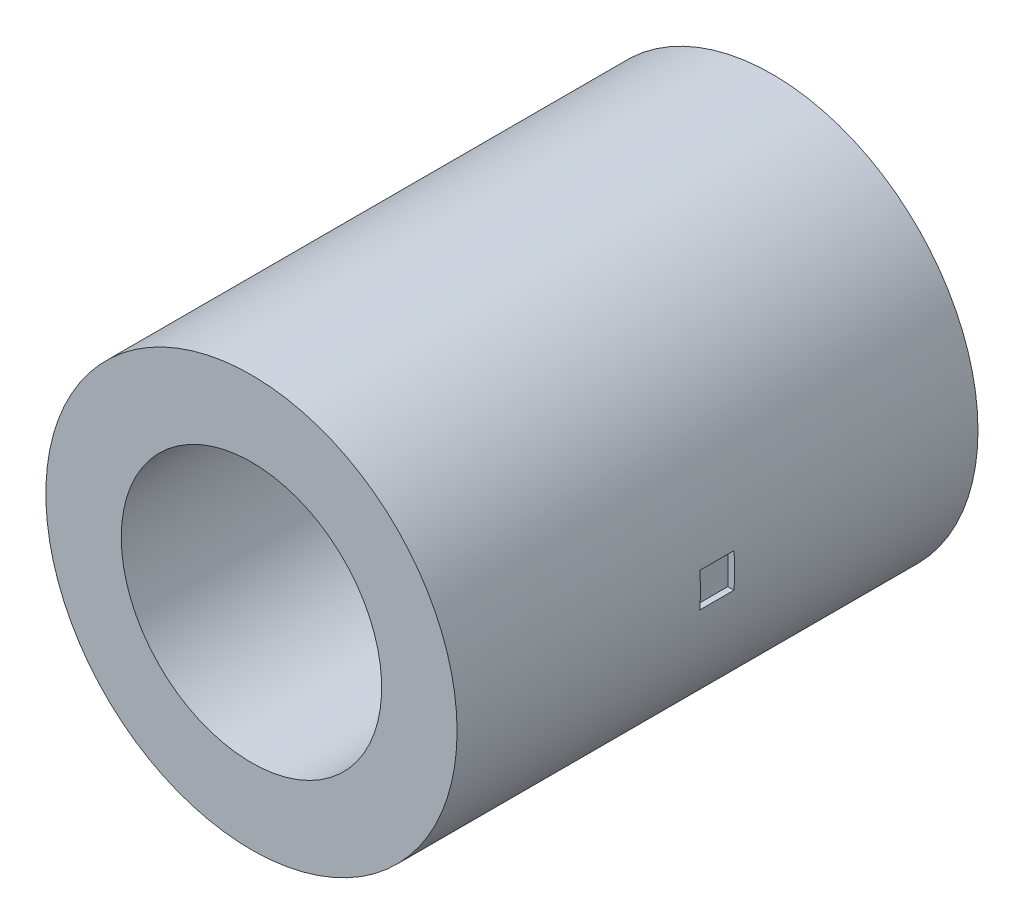
ISO-10303-21;
HEADER;
FILE_DESCRIPTION(('STEP AP214'),'2;1');
FILE_NAME('part.step','',(''),(''),'','','');
FILE_SCHEMA(('AUTOMOTIVE_DESIGN { 1 0 10303 214 1 1 1 1 }'));
ENDSEC;
DATA;
#1=APPLICATION_CONTEXT('core data for automotive mechanical design processes');
#2=APPLICATION_PROTOCOL_DEFINITION('international standard','automotive_design',2000,#1);
#3=PRODUCT_CONTEXT('',#1,'mechanical');
#4=PRODUCT('Part','Part','',(#3));
#5=PRODUCT_RELATED_PRODUCT_CATEGORY('part','',(#4));
#6=PRODUCT_DEFINITION_FORMATION('','',#4);
#7=PRODUCT_DEFINITION_CONTEXT('part definition',#1,'design');
#8=PRODUCT_DEFINITION('design','',#6,#7);
#9=PRODUCT_DEFINITION_SHAPE('','',#8);
#10=(LENGTH_UNIT() NAMED_UNIT(*) SI_UNIT(.MILLI.,.METRE.));
#11=(NAMED_UNIT(*) PLANE_ANGLE_UNIT() SI_UNIT($,.RADIAN.));
#12=(NAMED_UNIT(*) SI_UNIT($,.STERADIAN.) SOLID_ANGLE_UNIT());
#13=UNCERTAINTY_MEASURE_WITH_UNIT(LENGTH_MEASURE(1.E-05),#10,'distance_accuracy_value','');
#14=(GEOMETRIC_REPRESENTATION_CONTEXT(3) GLOBAL_UNCERTAINTY_ASSIGNED_CONTEXT((#13)) GLOBAL_UNIT_ASSIGNED_CONTEXT((#10,
#11,#12)) REPRESENTATION_CONTEXT('',''));
#15=CARTESIAN_POINT('',(0.,0.,0.));
#16=DIRECTION('',(0.,0.,1.));
#17=DIRECTION('',(1.,0.,0.));
#18=AXIS2_PLACEMENT_3D('',#15,#16,#17);
#19=CARTESIAN_POINT('',(0.,0.,7.6));
#20=DIRECTION('',(0.,0.,-1.));
#21=DIRECTION('',(-1.,0.,0.));
#22=AXIS2_PLACEMENT_3D('',#19,#20,#21);
#23=CYLINDRICAL_SURFACE('',#22,3.);
#24=CARTESIAN_POINT('',(0.,0.,3.55));
#25=DIRECTION('',(0.,0.,-1.));
#26=DIRECTION('',(-1.,0.,0.));
#27=AXIS2_PLACEMENT_3D('',#24,#25,#26);
#28=CIRCLE('',#27,3.);
#29=CARTESIAN_POINT('',(-2.98956518577535,-0.25,3.55));
#30=VERTEX_POINT('',#29);
#31=CARTESIAN_POINT('',(-2.98956518577535,0.25,3.55));
#32=VERTEX_POINT('',#31);
#33=EDGE_CURVE('E164',#30,#32,#28,.T.);
#34=ORIENTED_EDGE('',*,*,#33,.T.);
#35=DIRECTION('',(0.,0.,-1.));
#36=VECTOR('',#35,1.);
#37=CARTESIAN_POINT('',(-2.98956518577535,0.25,7.6));
#38=LINE('',#37,#36);
#39=CARTESIAN_POINT('',(-2.98956518577535,0.25,4.05));
#40=VERTEX_POINT('',#39);
#41=EDGE_CURVE('E169',#32,#40,#38,.F.);
#42=ORIENTED_EDGE('',*,*,#41,.T.);
#43=CARTESIAN_POINT('',(0.,0.,4.05));
#44=DIRECTION('',(0.,0.,1.));
#45=DIRECTION('',(1.,0.,0.));
#46=AXIS2_PLACEMENT_3D('',#43,#44,#45);
#47=CIRCLE('',#46,3.);
#48=CARTESIAN_POINT('',(-2.98956518577535,-0.25,4.05));
#49=VERTEX_POINT('',#48);
#50=EDGE_CURVE('E159',#40,#49,#47,.T.);
#51=ORIENTED_EDGE('',*,*,#50,.T.);
#52=DIRECTION('',(0.,0.,-1.));
#53=VECTOR('',#52,1.);
#54=CARTESIAN_POINT('',(-2.98956518577535,-0.25,7.6));
#55=LINE('',#54,#53);
#56=EDGE_CURVE('E166',#49,#30,#55,.T.);
#57=ORIENTED_EDGE('',*,*,#56,.T.);
#58=EDGE_LOOP('',(#34,#42,#51,#57));
#59=FACE_BOUND('',#58,.T.);
#60=CARTESIAN_POINT('',(0.,0.,7.6));
#61=DIRECTION('',(0.,0.,1.));
#62=DIRECTION('',(1.,0.,0.));
#63=AXIS2_PLACEMENT_3D('',#60,#61,#62);
#64=CIRCLE('',#63,3.);
#65=CARTESIAN_POINT('',(3.,0.,7.6));
#66=VERTEX_POINT('',#65);
#67=EDGE_CURVE('E156',#66,#66,#64,.T.);
#68=ORIENTED_EDGE('',*,*,#67,.F.);
#69=EDGE_LOOP('',(#68));
#70=FACE_BOUND('',#69,.T.);
#71=CARTESIAN_POINT('',(0.,0.,0.));
#72=DIRECTION('',(0.,0.,1.));
#73=DIRECTION('',(1.,0.,0.));
#74=AXIS2_PLACEMENT_3D('',#71,#72,#73);
#75=CIRCLE('',#74,3.);
#76=CARTESIAN_POINT('',(3.,0.,0.));
#77=VERTEX_POINT('',#76);
#78=EDGE_CURVE('E153',#77,#77,#75,.T.);
#79=ORIENTED_EDGE('',*,*,#78,.T.);
#80=EDGE_LOOP('',(#79));
#81=FACE_BOUND('',#80,.T.);
#82=CARTESIAN_POINT('',(0.,0.,4.05));
#83=DIRECTION('',(0.,0.,-1.));
#84=DIRECTION('',(-1.,0.,0.));
#85=AXIS2_PLACEMENT_3D('',#82,#83,#84);
#86=CIRCLE('',#85,3.);
#87=CARTESIAN_POINT('',(2.98956518577535,0.25,4.05));
#88=VERTEX_POINT('',#87);
#89=CARTESIAN_POINT('',(2.98956518577535,-0.25,4.05));
#90=VERTEX_POINT('',#89);
#91=EDGE_CURVE('E172',#88,#90,#86,.T.);
#92=ORIENTED_EDGE('',*,*,#91,.F.);
#93=DIRECTION('',(0.,0.,-1.));
#94=VECTOR('',#93,1.);
#95=CARTESIAN_POINT('',(2.98956518577535,0.25,7.6));
#96=LINE('',#95,#94);
#97=CARTESIAN_POINT('',(2.98956518577535,0.25,3.55));
#98=VERTEX_POINT('',#97);
#99=EDGE_CURVE('E11',#98,#88,#96,.F.);
#100=ORIENTED_EDGE('',*,*,#99,.F.);
#101=CARTESIAN_POINT('',(0.,0.,3.55));
#102=DIRECTION('',(0.,0.,1.));
#103=DIRECTION('',(1.,0.,0.));
#104=AXIS2_PLACEMENT_3D('',#101,#102,#103);
#105=CIRCLE('',#104,3.);
#106=CARTESIAN_POINT('',(2.98956518577535,-0.25,3.55));
#107=VERTEX_POINT('',#106);
#108=EDGE_CURVE('E41',#107,#98,#105,.T.);
#109=ORIENTED_EDGE('',*,*,#108,.F.);
#110=DIRECTION('',(0.,0.,-1.));
#111=VECTOR('',#110,1.);
#112=CARTESIAN_POINT('',(2.98956518577535,-0.25,7.6));
#113=LINE('',#112,#111);
#114=EDGE_CURVE('E174',#90,#107,#113,.T.);
#115=ORIENTED_EDGE('',*,*,#114,.F.);
#116=EDGE_LOOP('',(#92,#100,#109,#115));
#117=FACE_BOUND('',#116,.T.);
#118=ADVANCED_FACE('F34',(#59,#70,#81,#117),#23,.T.);
#119=CARTESIAN_POINT('',(0.,0.,7.6));
#120=DIRECTION('',(0.,0.,1.));
#121=DIRECTION('',(1.,0.,0.));
#122=AXIS2_PLACEMENT_3D('',#119,#120,#121);
#123=PLANE('',#122);
#124=ORIENTED_EDGE('',*,*,#67,.T.);
#125=EDGE_LOOP('',(#124));
#126=FACE_BOUND('',#125,.T.);
#127=CARTESIAN_POINT('',(0.,0.,7.6));
#128=DIRECTION('',(0.,0.,1.));
#129=DIRECTION('',(1.,0.,0.));
#130=AXIS2_PLACEMENT_3D('',#127,#128,#129);
#131=CIRCLE('',#130,1.9);
#132=CARTESIAN_POINT('',(-1.9,0.,7.6));
#133=VERTEX_POINT('',#132);
#134=EDGE_CURVE('E150',#133,#133,#131,.T.);
#135=ORIENTED_EDGE('',*,*,#134,.F.);
#136=EDGE_LOOP('',(#135));
#137=FACE_BOUND('',#136,.T.);
#138=ADVANCED_FACE('F191',(#126,#137),#123,.T.);
#139=CARTESIAN_POINT('',(0.,0.,0.));
#140=DIRECTION('',(0.,0.,1.));
#141=DIRECTION('',(1.,0.,0.));
#142=AXIS2_PLACEMENT_3D('',#139,#140,#141);
#143=PLANE('',#142);
#144=ORIENTED_EDGE('',*,*,#78,.F.);
#145=EDGE_LOOP('',(#144));
#146=FACE_BOUND('',#145,.T.);
#147=CARTESIAN_POINT('',(0.,0.,0.));
#148=DIRECTION('',(0.,0.,1.));
#149=DIRECTION('',(1.,0.,0.));
#150=AXIS2_PLACEMENT_3D('',#147,#148,#149);
#151=CIRCLE('',#150,1.9);
#152=CARTESIAN_POINT('',(-1.9,0.,0.));
#153=VERTEX_POINT('',#152);
#154=EDGE_CURVE('E142',#153,#153,#151,.T.);
#155=ORIENTED_EDGE('',*,*,#154,.T.);
#156=EDGE_LOOP('',(#155));
#157=FACE_BOUND('',#156,.T.);
#158=ADVANCED_FACE('F196',(#146,#157),#143,.F.);
#159=CARTESIAN_POINT('',(0.,0.,7.6));
#160=DIRECTION('',(0.,0.,-1.));
#161=DIRECTION('',(-1.,0.,0.));
#162=AXIS2_PLACEMENT_3D('',#159,#160,#161);
#163=CYLINDRICAL_SURFACE('',#162,1.9);
#164=CARTESIAN_POINT('',(-1.9,0.,7.6));
#165=CARTESIAN_POINT('',(-1.9,0.,7.52083333333333));
#166=CARTESIAN_POINT('',(-1.9,0.,7.44166666666667));
#167=CARTESIAN_POINT('',(-1.9,0.,7.28333333333333));
#168=CARTESIAN_POINT('',(-1.9,0.,7.20416666666667));
#169=CARTESIAN_POINT('',(-1.9,0.,7.04583333333333));
#170=CARTESIAN_POINT('',(-1.9,0.,6.96666666666667));
#171=CARTESIAN_POINT('',(-1.9,0.,6.80833333333333));
#172=CARTESIAN_POINT('',(-1.9,0.,6.72916666666667));
#173=CARTESIAN_POINT('',(-1.9,0.,6.57083333333333));
#174=CARTESIAN_POINT('',(-1.9,0.,6.49166666666667));
#175=CARTESIAN_POINT('',(-1.9,0.,6.33333333333333));
#176=CARTESIAN_POINT('',(-1.9,0.,6.25416666666667));
#177=CARTESIAN_POINT('',(-1.9,0.,6.09583333333333));
#178=CARTESIAN_POINT('',(-1.9,0.,6.01666666666667));
#179=CARTESIAN_POINT('',(-1.9,0.,5.85833333333333));
#180=CARTESIAN_POINT('',(-1.9,0.,5.77916666666667));
#181=CARTESIAN_POINT('',(-1.9,0.,5.62083333333333));
#182=CARTESIAN_POINT('',(-1.9,0.,5.54166666666667));
#183=CARTESIAN_POINT('',(-1.9,0.,5.38333333333333));
#184=CARTESIAN_POINT('',(-1.9,0.,5.30416666666667));
#185=CARTESIAN_POINT('',(-1.9,0.,5.14583333333333));
#186=CARTESIAN_POINT('',(-1.9,0.,5.06666666666667));
#187=CARTESIAN_POINT('',(-1.9,0.,4.90833333333333));
#188=CARTESIAN_POINT('',(-1.9,0.,4.82916666666667));
#189=CARTESIAN_POINT('',(-1.9,0.,4.67083333333333));
#190=CARTESIAN_POINT('',(-1.9,0.,4.59166666666667));
#191=CARTESIAN_POINT('',(-1.9,0.,4.43333333333333));
#192=CARTESIAN_POINT('',(-1.9,0.,4.35416666666667));
#193=CARTESIAN_POINT('',(-1.9,0.,4.19583333333333));
#194=CARTESIAN_POINT('',(-1.9,0.,4.11666666666667));
#195=CARTESIAN_POINT('',(-1.9,0.,3.95833333333333));
#196=CARTESIAN_POINT('',(-1.9,0.,3.87916666666667));
#197=CARTESIAN_POINT('',(-1.9,0.,3.72083333333333));
#198=CARTESIAN_POINT('',(-1.9,0.,3.64166666666667));
#199=CARTESIAN_POINT('',(-1.9,0.,3.48333333333333));
#200=CARTESIAN_POINT('',(-1.9,0.,3.40416666666667));
#201=CARTESIAN_POINT('',(-1.9,0.,3.24583333333333));
#202=CARTESIAN_POINT('',(-1.9,0.,3.16666666666667));
#203=CARTESIAN_POINT('',(-1.9,0.,3.00833333333333));
#204=CARTESIAN_POINT('',(-1.9,0.,2.92916666666667));
#205=CARTESIAN_POINT('',(-1.9,0.,2.77083333333333));
#206=CARTESIAN_POINT('',(-1.9,0.,2.69166666666667));
#207=CARTESIAN_POINT('',(-1.9,0.,2.53333333333333));
#208=CARTESIAN_POINT('',(-1.9,0.,2.45416666666667));
#209=CARTESIAN_POINT('',(-1.9,0.,2.29583333333333));
#210=CARTESIAN_POINT('',(-1.9,0.,2.21666666666667));
#211=CARTESIAN_POINT('',(-1.9,0.,2.05833333333333));
#212=CARTESIAN_POINT('',(-1.9,0.,1.97916666666667));
#213=CARTESIAN_POINT('',(-1.9,0.,1.82083333333333));
#214=CARTESIAN_POINT('',(-1.9,0.,1.74166666666667));
#215=CARTESIAN_POINT('',(-1.9,0.,1.58333333333333));
#216=CARTESIAN_POINT('',(-1.9,0.,1.50416666666667));
#217=CARTESIAN_POINT('',(-1.9,0.,1.34583333333333));
#218=CARTESIAN_POINT('',(-1.9,0.,1.26666666666667));
#219=CARTESIAN_POINT('',(-1.9,0.,1.10833333333333));
#220=CARTESIAN_POINT('',(-1.9,0.,1.02916666666667));
#221=CARTESIAN_POINT('',(-1.9,0.,0.870833333333333));
#222=CARTESIAN_POINT('',(-1.9,0.,0.791666666666667));
#223=CARTESIAN_POINT('',(-1.9,0.,0.633333333333333));
#224=CARTESIAN_POINT('',(-1.9,0.,0.554166666666666));
#225=CARTESIAN_POINT('',(-1.9,0.,0.395833333333333));
#226=CARTESIAN_POINT('',(-1.9,0.,0.316666666666667));
#227=CARTESIAN_POINT('',(-1.9,0.,0.158333333333333));
#228=CARTESIAN_POINT('',(-1.9,0.,0.0791666666666665));
#229=CARTESIAN_POINT('',(-1.9,0.,0.));
#230=B_SPLINE_CURVE_WITH_KNOTS('',3,(#164,#165,#166,#167,#168,#169,#170,#171,#172,#173,#174,
#175,#176,#177,#178,#179,#180,#181,#182,#183,#184,#185,#186,#187,#188,#189,#190,#191,#192,#193,
#194,#195,#196,#197,#198,#199,#200,#201,#202,#203,#204,#205,#206,#207,#208,#209,#210,#211,#212,
#213,#214,#215,#216,#217,#218,#219,#220,#221,#222,#223,#224,#225,#226,#227,#228,#229),
.UNSPECIFIED.,.F.,.F.,(4,2,2,2,2,2,2,2,2,2,2,2,2,2,2,2,2,2,2,2,2,2,2,2,2,2,2,2,2,2,2,2,4),(0.,
0.2375,0.475,0.7125,0.95,1.1875,1.425,1.6625,1.9,2.1375,2.375,2.6125,2.85,3.0875,3.325,3.5625,
3.8,4.0375,4.275,4.5125,4.75,4.9875,5.225,5.4625,5.7,5.9375,6.175,6.4125,6.65,6.8875,7.125,
7.3625,7.6),.UNSPECIFIED.);
#231=EDGE_CURVE('BSEAM207',#133,#153,#230,.T.);
#232=ORIENTED_EDGE('',*,*,#134,.T.);
#233=ORIENTED_EDGE('',*,*,#154,.F.);
#234=ORIENTED_EDGE('',*,*,#231,.T.);
#235=ORIENTED_EDGE('',*,*,#231,.F.);
#236=EDGE_LOOP('',(#232,#234,#233,#235));
#237=FACE_BOUND('',#236,.T.);
#238=ADVANCED_FACE('F207',(#237),#163,.F.);
#239=CARTESIAN_POINT('',(-2.9,0.25,3.55));
#240=DIRECTION('',(0.,0.,-1.));
#241=DIRECTION('',(-1.,0.,0.));
#242=AXIS2_PLACEMENT_3D('',#239,#240,#241);
#243=PLANE('',#242);
#244=ORIENTED_EDGE('',*,*,#33,.F.);
#245=DIRECTION('',(-1.,0.,0.));
#246=VECTOR('',#245,1.);
#247=CARTESIAN_POINT('',(-2.9,-0.25,3.55));
#248=LINE('',#247,#246);
#249=CARTESIAN_POINT('',(-2.9,-0.25,3.55));
#250=VERTEX_POINT('',#249);
#251=EDGE_CURVE('E55',#250,#30,#248,.T.);
#252=ORIENTED_EDGE('',*,*,#251,.F.);
#253=DIRECTION('',(0.,-1.,0.));
#254=VECTOR('',#253,1.);
#255=CARTESIAN_POINT('',(-2.9,0.25,3.55));
#256=LINE('',#255,#254);
#257=CARTESIAN_POINT('',(-2.9,0.25,3.55));
#258=VERTEX_POINT('',#257);
#259=EDGE_CURVE('E123',#258,#250,#256,.T.);
#260=ORIENTED_EDGE('',*,*,#259,.F.);
#261=DIRECTION('',(-1.,0.,0.));
#262=VECTOR('',#261,1.);
#263=CARTESIAN_POINT('',(-2.9,0.25,3.55));
#264=LINE('',#263,#262);
#265=EDGE_CURVE('E139',#258,#32,#264,.T.);
#266=ORIENTED_EDGE('',*,*,#265,.T.);
#267=EDGE_LOOP('',(#244,#252,#260,#266));
#268=FACE_BOUND('',#267,.T.);
#269=ADVANCED_FACE('F211',(#268),#243,.F.);
#270=CARTESIAN_POINT('',(-2.9,0.25,3.55));
#271=DIRECTION('',(0.,1.,0.));
#272=DIRECTION('',(0.,0.,1.));
#273=AXIS2_PLACEMENT_3D('',#270,#271,#272);
#274=PLANE('',#273);
#275=ORIENTED_EDGE('',*,*,#265,.F.);
#276=DIRECTION('',(0.,0.,-1.));
#277=VECTOR('',#276,1.);
#278=CARTESIAN_POINT('',(-2.9,0.25,3.55));
#279=LINE('',#278,#277);
#280=CARTESIAN_POINT('',(-2.9,0.25,4.05));
#281=VERTEX_POINT('',#280);
#282=EDGE_CURVE('E136',#281,#258,#279,.T.);
#283=ORIENTED_EDGE('',*,*,#282,.F.);
#284=DIRECTION('',(-1.,0.,0.));
#285=VECTOR('',#284,1.);
#286=CARTESIAN_POINT('',(-2.9,0.25,4.05));
#287=LINE('',#286,#285);
#288=EDGE_CURVE('E143',#281,#40,#287,.T.);
#289=ORIENTED_EDGE('',*,*,#288,.T.);
#290=ORIENTED_EDGE('',*,*,#41,.F.);
#291=EDGE_LOOP('',(#275,#283,#289,#290));
#292=FACE_BOUND('',#291,.T.);
#293=ADVANCED_FACE('F217',(#292),#274,.F.);
#294=CARTESIAN_POINT('',(-2.9,0.25,4.05));
#295=DIRECTION('',(0.,0.,1.));
#296=DIRECTION('',(1.,0.,0.));
#297=AXIS2_PLACEMENT_3D('',#294,#295,#296);
#298=PLANE('',#297);
#299=ORIENTED_EDGE('',*,*,#288,.F.);
#300=DIRECTION('',(0.,1.,0.));
#301=VECTOR('',#300,1.);
#302=CARTESIAN_POINT('',(-2.9,0.25,4.05));
#303=LINE('',#302,#301);
#304=CARTESIAN_POINT('',(-2.9,-0.25,4.05));
#305=VERTEX_POINT('',#304);
#306=EDGE_CURVE('E133',#305,#281,#303,.T.);
#307=ORIENTED_EDGE('',*,*,#306,.F.);
#308=DIRECTION('',(-1.,0.,0.));
#309=VECTOR('',#308,1.);
#310=CARTESIAN_POINT('',(-2.9,-0.25,4.05));
#311=LINE('',#310,#309);
#312=EDGE_CURVE('E146',#305,#49,#311,.T.);
#313=ORIENTED_EDGE('',*,*,#312,.T.);
#314=ORIENTED_EDGE('',*,*,#50,.F.);
#315=EDGE_LOOP('',(#299,#307,#313,#314));
#316=FACE_BOUND('',#315,.T.);
#317=ADVANCED_FACE('F225',(#316),#298,.F.);
#318=CARTESIAN_POINT('',(-2.9,-0.25,3.55));
#319=DIRECTION('',(0.,-1.,0.));
#320=DIRECTION('',(0.,0.,-1.));
#321=AXIS2_PLACEMENT_3D('',#318,#319,#320);
#322=PLANE('',#321);
#323=ORIENTED_EDGE('',*,*,#312,.F.);
#324=DIRECTION('',(0.,0.,1.));
#325=VECTOR('',#324,1.);
#326=CARTESIAN_POINT('',(-2.9,-0.25,3.55));
#327=LINE('',#326,#325);
#328=EDGE_CURVE('E130',#250,#305,#327,.T.);
#329=ORIENTED_EDGE('',*,*,#328,.F.);
#330=ORIENTED_EDGE('',*,*,#251,.T.);
#331=ORIENTED_EDGE('',*,*,#56,.F.);
#332=EDGE_LOOP('',(#323,#329,#330,#331));
#333=FACE_BOUND('',#332,.T.);
#334=ADVANCED_FACE('F221',(#333),#322,.F.);
#335=CARTESIAN_POINT('',(-2.9,0.,0.));
#336=DIRECTION('',(-1.,0.,0.));
#337=DIRECTION('',(0.,0.,1.));
#338=AXIS2_PLACEMENT_3D('',#335,#336,#337);
#339=PLANE('',#338);
#340=ORIENTED_EDGE('',*,*,#259,.T.);
#341=ORIENTED_EDGE('',*,*,#328,.T.);
#342=ORIENTED_EDGE('',*,*,#306,.T.);
#343=ORIENTED_EDGE('',*,*,#282,.T.);
#344=EDGE_LOOP('',(#340,#341,#342,#343));
#345=FACE_BOUND('',#344,.T.);
#346=ADVANCED_FACE('F224',(#345),#339,.T.);
#347=CARTESIAN_POINT('',(2.9,0.25,3.55));
#348=DIRECTION('',(0.,0.,1.));
#349=DIRECTION('',(1.,0.,0.));
#350=AXIS2_PLACEMENT_3D('',#347,#348,#349);
#351=PLANE('',#350);
#352=ORIENTED_EDGE('',*,*,#108,.T.);
#353=DIRECTION('',(1.,0.,0.));
#354=VECTOR('',#353,1.);
#355=CARTESIAN_POINT('',(2.9,0.25,3.55));
#356=LINE('',#355,#354);
#357=CARTESIAN_POINT('',(2.9,0.25,3.55));
#358=VERTEX_POINT('',#357);
#359=EDGE_CURVE('E101',#358,#98,#356,.T.);
#360=ORIENTED_EDGE('',*,*,#359,.F.);
#361=DIRECTION('',(0.,-1.,0.));
#362=VECTOR('',#361,1.);
#363=CARTESIAN_POINT('',(2.9,0.25,3.55));
#364=LINE('',#363,#362);
#365=CARTESIAN_POINT('',(2.9,-0.25,3.55));
#366=VERTEX_POINT('',#365);
#367=EDGE_CURVE('E109',#358,#366,#364,.T.);
#368=ORIENTED_EDGE('',*,*,#367,.T.);
#369=DIRECTION('',(1.,0.,0.));
#370=VECTOR('',#369,1.);
#371=CARTESIAN_POINT('',(2.9,-0.25,3.55));
#372=LINE('',#371,#370);
#373=EDGE_CURVE('E121',#366,#107,#372,.T.);
#374=ORIENTED_EDGE('',*,*,#373,.T.);
#375=EDGE_LOOP('',(#352,#360,#368,#374));
#376=FACE_BOUND('',#375,.T.);
#377=ADVANCED_FACE('F112',(#376),#351,.T.);
#378=CARTESIAN_POINT('',(2.9,-0.25,3.55));
#379=DIRECTION('',(0.,1.,0.));
#380=DIRECTION('',(0.,0.,1.));
#381=AXIS2_PLACEMENT_3D('',#378,#379,#380);
#382=PLANE('',#381);
#383=ORIENTED_EDGE('',*,*,#114,.T.);
#384=ORIENTED_EDGE('',*,*,#373,.F.);
#385=DIRECTION('',(0.,0.,1.));
#386=VECTOR('',#385,1.);
#387=CARTESIAN_POINT('',(2.9,-0.25,3.55));
#388=LINE('',#387,#386);
#389=CARTESIAN_POINT('',(2.9,-0.25,4.05));
#390=VERTEX_POINT('',#389);
#391=EDGE_CURVE('E114',#366,#390,#388,.T.);
#392=ORIENTED_EDGE('',*,*,#391,.T.);
#393=DIRECTION('',(1.,0.,0.));
#394=VECTOR('',#393,1.);
#395=CARTESIAN_POINT('',(2.9,-0.25,4.05));
#396=LINE('',#395,#394);
#397=EDGE_CURVE('E124',#390,#90,#396,.T.);
#398=ORIENTED_EDGE('',*,*,#397,.T.);
#399=EDGE_LOOP('',(#383,#384,#392,#398));
#400=FACE_BOUND('',#399,.T.);
#401=ADVANCED_FACE('F177',(#400),#382,.T.);
#402=CARTESIAN_POINT('',(2.9,0.25,4.05));
#403=DIRECTION('',(0.,0.,-1.));
#404=DIRECTION('',(-1.,0.,0.));
#405=AXIS2_PLACEMENT_3D('',#402,#403,#404);
#406=PLANE('',#405);
#407=DIRECTION('',(1.,0.,0.));
#408=VECTOR('',#407,1.);
#409=CARTESIAN_POINT('',(2.9,0.25,4.05));
#410=LINE('',#409,#408);
#411=CARTESIAN_POINT('',(2.9,0.25,4.05));
#412=VERTEX_POINT('',#411);
#413=EDGE_CURVE('E104',#412,#88,#410,.T.);
#414=ORIENTED_EDGE('',*,*,#413,.T.);
#415=ORIENTED_EDGE('',*,*,#91,.T.);
#416=ORIENTED_EDGE('',*,*,#397,.F.);
#417=DIRECTION('',(0.,1.,0.));
#418=VECTOR('',#417,1.);
#419=CARTESIAN_POINT('',(2.9,0.25,4.05));
#420=LINE('',#419,#418);
#421=EDGE_CURVE('E108',#390,#412,#420,.T.);
#422=ORIENTED_EDGE('',*,*,#421,.T.);
#423=EDGE_LOOP('',(#414,#415,#416,#422));
#424=FACE_BOUND('',#423,.T.);
#425=ADVANCED_FACE('F181',(#424),#406,.T.);
#426=CARTESIAN_POINT('',(2.9,0.25,3.55));
#427=DIRECTION('',(0.,-1.,0.));
#428=DIRECTION('',(0.,0.,-1.));
#429=AXIS2_PLACEMENT_3D('',#426,#427,#428);
#430=PLANE('',#429);
#431=ORIENTED_EDGE('',*,*,#99,.T.);
#432=ORIENTED_EDGE('',*,*,#413,.F.);
#433=DIRECTION('',(0.,0.,-1.));
#434=VECTOR('',#433,1.);
#435=CARTESIAN_POINT('',(2.9,0.25,3.55));
#436=LINE('',#435,#434);
#437=EDGE_CURVE('E99',#412,#358,#436,.T.);
#438=ORIENTED_EDGE('',*,*,#437,.T.);
#439=ORIENTED_EDGE('',*,*,#359,.T.);
#440=EDGE_LOOP('',(#431,#432,#438,#439));
#441=FACE_BOUND('',#440,.T.);
#442=ADVANCED_FACE('F100',(#441),#430,.T.);
#443=CARTESIAN_POINT('',(2.9,0.,0.));
#444=DIRECTION('',(1.,0.,0.));
#445=DIRECTION('',(0.,0.,1.));
#446=AXIS2_PLACEMENT_3D('',#443,#444,#445);
#447=PLANE('',#446);
#448=ORIENTED_EDGE('',*,*,#367,.F.);
#449=ORIENTED_EDGE('',*,*,#437,.F.);
#450=ORIENTED_EDGE('',*,*,#421,.F.);
#451=ORIENTED_EDGE('',*,*,#391,.F.);
#452=EDGE_LOOP('',(#448,#449,#450,#451));
#453=FACE_BOUND('',#452,.T.);
#454=ADVANCED_FACE('F116',(#453),#447,.T.);
#455=CLOSED_SHELL('',(#118,#138,#158,#238,#269,#293,#317,#334,#346,#377,#401,#425,#442,#454));
#456=MANIFOLD_SOLID_BREP('B2',#455);
#457=ADVANCED_BREP_SHAPE_REPRESENTATION('',(#18,#456),#14);
#458=SHAPE_DEFINITION_REPRESENTATION(#9,#457);
ENDSEC;
END-ISO-10303-21;
